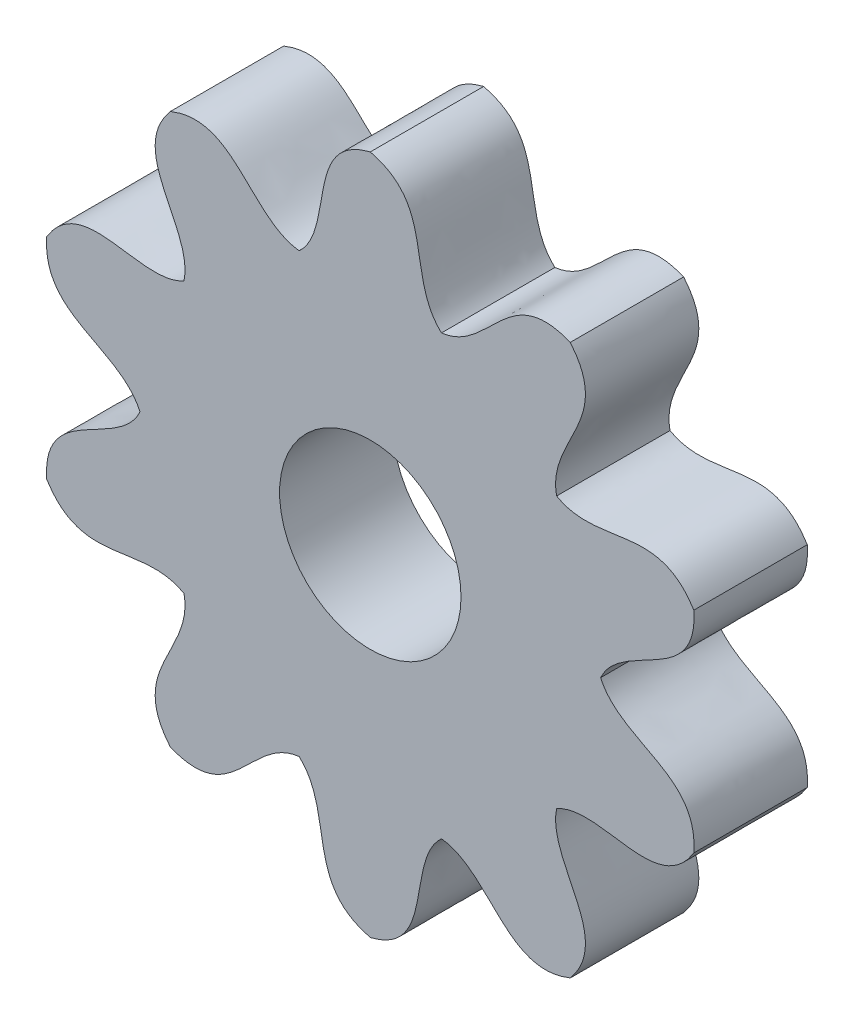
ISO-10303-21;
HEADER;
FILE_DESCRIPTION(('STEP AP214'),'2;1');
FILE_NAME('part.step','',(''),(''),'','','');
FILE_SCHEMA(('AUTOMOTIVE_DESIGN { 1 0 10303 214 1 1 1 1 }'));
ENDSEC;
DATA;
#1=APPLICATION_CONTEXT('core data for automotive mechanical design processes');
#2=APPLICATION_PROTOCOL_DEFINITION('international standard','automotive_design',2000,#1);
#3=PRODUCT_CONTEXT('',#1,'mechanical');
#4=PRODUCT('Part','Part','',(#3));
#5=PRODUCT_RELATED_PRODUCT_CATEGORY('part','',(#4));
#6=PRODUCT_DEFINITION_FORMATION('','',#4);
#7=PRODUCT_DEFINITION_CONTEXT('part definition',#1,'design');
#8=PRODUCT_DEFINITION('design','',#6,#7);
#9=PRODUCT_DEFINITION_SHAPE('','',#8);
#10=(LENGTH_UNIT() NAMED_UNIT(*) SI_UNIT(.MILLI.,.METRE.));
#11=(NAMED_UNIT(*) PLANE_ANGLE_UNIT() SI_UNIT($,.RADIAN.));
#12=(NAMED_UNIT(*) SI_UNIT($,.STERADIAN.) SOLID_ANGLE_UNIT());
#13=UNCERTAINTY_MEASURE_WITH_UNIT(LENGTH_MEASURE(1.E-05),#10,'distance_accuracy_value','');
#14=(GEOMETRIC_REPRESENTATION_CONTEXT(3) GLOBAL_UNCERTAINTY_ASSIGNED_CONTEXT((#13)) GLOBAL_UNIT_ASSIGNED_CONTEXT((#10,
#11,#12)) REPRESENTATION_CONTEXT('',''));
#15=CARTESIAN_POINT('',(0.,0.,0.));
#16=DIRECTION('',(0.,0.,1.));
#17=DIRECTION('',(1.,0.,0.));
#18=AXIS2_PLACEMENT_3D('',#15,#16,#17);
#19=CARTESIAN_POINT('',(-8.81677878438694,12.1352549156243,5.));
#20=CARTESIAN_POINT('',(-5.78764525168965,13.3651357182011,5.));
#21=CARTESIAN_POINT('',(-5.20847059966694,9.34250488062444,5.));
#22=CARTESIAN_POINT('',(-2.58868303739153,9.65912626130963,5.));
#23=B_SPLINE_CURVE_WITH_KNOTS('',3,(#19,#20,#21,#22),.UNSPECIFIED.,.F.,.F.,(4,4),(0.,1.),.UNSPECIFIED.);
#24=DIRECTION('',(0.,0.,-1.));
#25=VECTOR('',#24,1.);
#26=SURFACE_OF_LINEAR_EXTRUSION('',#23,#25);
#27=CARTESIAN_POINT('',(-8.81677878438694,12.1352549156243,0.));
#28=CARTESIAN_POINT('',(-5.78764525168965,13.3651357182011,0.));
#29=CARTESIAN_POINT('',(-5.20847059966694,9.34250488062444,0.));
#30=CARTESIAN_POINT('',(-2.58868303739153,9.65912626130963,0.));
#31=B_SPLINE_CURVE_WITH_KNOTS('',3,(#27,#28,#29,#30),.UNSPECIFIED.,.F.,.F.,(4,4),(0.,1.),.UNSPECIFIED.);
#32=CARTESIAN_POINT('',(-8.81677878438694,12.1352549156243,0.));
#33=VERTEX_POINT('',#32);
#34=CARTESIAN_POINT('',(-3.13745877046232,9.65610520636011,0.));
#35=VERTEX_POINT('',#34);
#36=EDGE_CURVE('E433',#33,#35,#31,.T.);
#37=ORIENTED_EDGE('',*,*,#36,.F.);
#38=DIRECTION('',(0.,0.,-1.));
#39=VECTOR('',#38,1.);
#40=CARTESIAN_POINT('',(-8.81677878438694,12.1352549156243,5.));
#41=LINE('',#40,#39);
#42=CARTESIAN_POINT('',(-8.81677878438694,12.1352549156243,5.));
#43=VERTEX_POINT('',#42);
#44=EDGE_CURVE('E11',#43,#33,#41,.T.);
#45=ORIENTED_EDGE('',*,*,#44,.F.);
#46=CARTESIAN_POINT('',(-3.13745877046232,9.65610520636011,5.));
#47=VERTEX_POINT('',#46);
#48=EDGE_CURVE('E603',#43,#47,#23,.T.);
#49=ORIENTED_EDGE('',*,*,#48,.T.);
#50=DIRECTION('',(0.,0.,-1.));
#51=VECTOR('',#50,1.);
#52=CARTESIAN_POINT('',(-3.13745877046232,9.65610520636011,5.));
#53=LINE('',#52,#51);
#54=EDGE_CURVE('E129',#47,#35,#53,.T.);
#55=ORIENTED_EDGE('',*,*,#54,.T.);
#56=EDGE_LOOP('',(#37,#45,#49,#55));
#57=FACE_BOUND('',#56,.T.);
#58=ADVANCED_FACE('F41',(#57),#26,.T.);
#59=CARTESIAN_POINT('',(-8.81677878438694,12.1352549156243,5.));
#60=CARTESIAN_POINT('',(-10.9225186757785,9.63443179967619,5.));
#61=CARTESIAN_POINT('',(-7.27574421523759,7.840542681889,5.));
#62=CARTESIAN_POINT('',(-8.38642792093188,5.44681803689219,5.));
#63=B_SPLINE_CURVE_WITH_KNOTS('',3,(#59,#60,#61,#62),.UNSPECIFIED.,.F.,.F.,(4,4),(0.,1.),.UNSPECIFIED.);
#64=DIRECTION('',(0.,0.,-1.));
#65=VECTOR('',#64,1.);
#66=SURFACE_OF_LINEAR_EXTRUSION('',#63,#65);
#67=CARTESIAN_POINT('',(-8.81677878438694,12.1352549156243,0.));
#68=CARTESIAN_POINT('',(-10.9225186757785,9.63443179967619,0.));
#69=CARTESIAN_POINT('',(-7.27574421523759,7.840542681889,0.));
#70=CARTESIAN_POINT('',(-8.38642792093188,5.44681803689219,0.));
#71=B_SPLINE_CURVE_WITH_KNOTS('',3,(#67,#68,#69,#70),.UNSPECIFIED.,.F.,.F.,(4,4),(0.,1.),.UNSPECIFIED.);
#72=CARTESIAN_POINT('',(-8.21397369931663,5.96780121649338,0.));
#73=VERTEX_POINT('',#72);
#74=EDGE_CURVE('E427',#33,#73,#71,.T.);
#75=ORIENTED_EDGE('',*,*,#74,.T.);
#76=DIRECTION('',(0.,0.,-1.));
#77=VECTOR('',#76,1.);
#78=CARTESIAN_POINT('',(-8.21397369931663,5.96780121649338,5.));
#79=LINE('',#78,#77);
#80=CARTESIAN_POINT('',(-8.21397369931663,5.96780121649338,5.));
#81=VERTEX_POINT('',#80);
#82=EDGE_CURVE('E51',#81,#73,#79,.T.);
#83=ORIENTED_EDGE('',*,*,#82,.F.);
#84=EDGE_CURVE('E408',#43,#81,#63,.T.);
#85=ORIENTED_EDGE('',*,*,#84,.F.);
#86=ORIENTED_EDGE('',*,*,#44,.T.);
#87=EDGE_LOOP('',(#75,#83,#85,#86));
#88=FACE_BOUND('',#87,.T.);
#89=ADVANCED_FACE('F417',(#88),#66,.F.);
#90=CARTESIAN_POINT('',(-14.2658477444273,4.63525491562437,5.));
#91=CARTESIAN_POINT('',(-12.5381330360764,7.41072940370857,5.));
#92=CARTESIAN_POINT('',(-9.70512781813433,4.49678301297288,5.));
#93=CARTESIAN_POINT('',(-7.77178053672865,6.2928075839744,5.));
#94=B_SPLINE_CURVE_WITH_KNOTS('',3,(#90,#91,#92,#93),.UNSPECIFIED.,.F.,.F.,(4,4),(0.,1.),.UNSPECIFIED.);
#95=DIRECTION('',(0.,0.,-1.));
#96=VECTOR('',#95,1.);
#97=SURFACE_OF_LINEAR_EXTRUSION('',#94,#96);
#98=CARTESIAN_POINT('',(-14.2658477444273,4.63525491562437,0.));
#99=CARTESIAN_POINT('',(-12.5381330360764,7.41072940370857,0.));
#100=CARTESIAN_POINT('',(-9.70512781813433,4.49678301297288,0.));
#101=CARTESIAN_POINT('',(-7.77178053672865,6.2928075839744,0.));
#102=B_SPLINE_CURVE_WITH_KNOTS('',3,(#98,#99,#100,#101),.UNSPECIFIED.,.F.,.F.,(4,4),(0.,1.),.UNSPECIFIED.);
#103=CARTESIAN_POINT('',(-14.2658477444273,4.63525491562437,0.));
#104=VERTEX_POINT('',#103);
#105=EDGE_CURVE('E432',#104,#73,#102,.T.);
#106=ORIENTED_EDGE('',*,*,#105,.F.);
#107=DIRECTION('',(0.,0.,-1.));
#108=VECTOR('',#107,1.);
#109=CARTESIAN_POINT('',(-14.2658477444273,4.63525491562437,5.));
#110=LINE('',#109,#108);
#111=CARTESIAN_POINT('',(-14.2658477444273,4.63525491562437,5.));
#112=VERTEX_POINT('',#111);
#113=EDGE_CURVE('E649',#112,#104,#110,.T.);
#114=ORIENTED_EDGE('',*,*,#113,.F.);
#115=EDGE_CURVE('E398',#112,#81,#94,.T.);
#116=ORIENTED_EDGE('',*,*,#115,.T.);
#117=ORIENTED_EDGE('',*,*,#82,.T.);
#118=EDGE_LOOP('',(#106,#114,#116,#117));
#119=FACE_BOUND('',#118,.T.);
#120=ADVANCED_FACE('F415',(#119),#97,.T.);
#121=CARTESIAN_POINT('',(-14.2658477444273,4.63525491562437,5.));
#122=CARTESIAN_POINT('',(-14.4994801561498,1.37432366157274,5.));
#123=CARTESIAN_POINT('',(-10.4947560752365,2.06655712560138,5.));
#124=CARTESIAN_POINT('',(-9.98632202414032,-0.522850294223837,5.));
#125=B_SPLINE_CURVE_WITH_KNOTS('',3,(#121,#122,#123,#124),.UNSPECIFIED.,.F.,.F.,(4,4),(0.,1.),.UNSPECIFIED.);
#126=DIRECTION('',(0.,0.,-1.));
#127=VECTOR('',#126,1.);
#128=SURFACE_OF_LINEAR_EXTRUSION('',#125,#127);
#129=CARTESIAN_POINT('',(-14.2658477444273,4.63525491562437,0.));
#130=CARTESIAN_POINT('',(-14.4994801561498,1.37432366157274,0.));
#131=CARTESIAN_POINT('',(-10.4947560752365,2.06655712560138,0.));
#132=CARTESIAN_POINT('',(-9.98632202414032,-0.522850294223837,0.));
#133=B_SPLINE_CURVE_WITH_KNOTS('',3,(#129,#130,#131,#132),.UNSPECIFIED.,.F.,.F.,(4,4),(0.,1.),.UNSPECIFIED.);
#134=CARTESIAN_POINT('',(-10.1530298577639,1.80528064285673E-11,0.));
#135=VERTEX_POINT('',#134);
#136=EDGE_CURVE('E441',#104,#135,#133,.T.);
#137=ORIENTED_EDGE('',*,*,#136,.T.);
#138=DIRECTION('',(0.,0.,-1.));
#139=VECTOR('',#138,1.);
#140=CARTESIAN_POINT('',(-10.1530298577639,1.80528064285673E-11,5.));
#141=LINE('',#140,#139);
#142=CARTESIAN_POINT('',(-10.1530298577639,1.80528064285673E-11,5.));
#143=VERTEX_POINT('',#142);
#144=EDGE_CURVE('E646',#143,#135,#141,.T.);
#145=ORIENTED_EDGE('',*,*,#144,.F.);
#146=EDGE_CURVE('E389',#112,#143,#125,.T.);
#147=ORIENTED_EDGE('',*,*,#146,.F.);
#148=ORIENTED_EDGE('',*,*,#113,.T.);
#149=EDGE_LOOP('',(#137,#145,#147,#148));
#150=FACE_BOUND('',#149,.T.);
#151=ADVANCED_FACE('F379',(#150),#128,.F.);
#152=CARTESIAN_POINT('',(-14.2658477444273,-4.63525491562407,5.));
#153=CARTESIAN_POINT('',(-14.4994801561499,-1.37432366157243,5.));
#154=CARTESIAN_POINT('',(-10.4947560752365,-2.06655712560116,5.));
#155=CARTESIAN_POINT('',(-9.98632202414031,0.522850294224045,5.));
#156=B_SPLINE_CURVE_WITH_KNOTS('',3,(#152,#153,#154,#155),.UNSPECIFIED.,.F.,.F.,(4,4),(0.,1.),.UNSPECIFIED.);
#157=DIRECTION('',(0.,0.,-1.));
#158=VECTOR('',#157,1.);
#159=SURFACE_OF_LINEAR_EXTRUSION('',#156,#158);
#160=CARTESIAN_POINT('',(-14.2658477444273,-4.63525491562407,0.));
#161=CARTESIAN_POINT('',(-14.4994801561499,-1.37432366157243,0.));
#162=CARTESIAN_POINT('',(-10.4947560752365,-2.06655712560116,0.));
#163=CARTESIAN_POINT('',(-9.98632202414031,0.522850294224045,0.));
#164=B_SPLINE_CURVE_WITH_KNOTS('',3,(#160,#161,#162,#163),.UNSPECIFIED.,.F.,.F.,(4,4),(0.,1.),.UNSPECIFIED.);
#165=CARTESIAN_POINT('',(-14.2658477444273,-4.63525491562407,0.));
#166=VERTEX_POINT('',#165);
#167=EDGE_CURVE('E445',#166,#135,#164,.T.);
#168=ORIENTED_EDGE('',*,*,#167,.F.);
#169=DIRECTION('',(0.,0.,-1.));
#170=VECTOR('',#169,1.);
#171=CARTESIAN_POINT('',(-14.2658477444273,-4.63525491562407,5.));
#172=LINE('',#171,#170);
#173=CARTESIAN_POINT('',(-14.2658477444273,-4.63525491562407,5.));
#174=VERTEX_POINT('',#173);
#175=EDGE_CURVE('E643',#174,#166,#172,.T.);
#176=ORIENTED_EDGE('',*,*,#175,.F.);
#177=EDGE_CURVE('E383',#174,#143,#156,.T.);
#178=ORIENTED_EDGE('',*,*,#177,.T.);
#179=ORIENTED_EDGE('',*,*,#144,.T.);
#180=EDGE_LOOP('',(#168,#176,#178,#179));
#181=FACE_BOUND('',#180,.T.);
#182=ADVANCED_FACE('F375',(#181),#159,.T.);
#183=CARTESIAN_POINT('',(-14.2658477444273,-4.63525491562407,5.));
#184=CARTESIAN_POINT('',(-12.5381330360766,-7.4107294037083,5.));
#185=CARTESIAN_POINT('',(-9.70512781813442,-4.49678301297268,5.));
#186=CARTESIAN_POINT('',(-7.77178053672878,-6.29280758397424,5.));
#187=B_SPLINE_CURVE_WITH_KNOTS('',3,(#183,#184,#185,#186),.UNSPECIFIED.,.F.,.F.,(4,4),(0.,1.),.UNSPECIFIED.);
#188=DIRECTION('',(0.,0.,-1.));
#189=VECTOR('',#188,1.);
#190=SURFACE_OF_LINEAR_EXTRUSION('',#187,#189);
#191=CARTESIAN_POINT('',(-14.2658477444273,-4.63525491562407,0.));
#192=CARTESIAN_POINT('',(-12.5381330360766,-7.4107294037083,0.));
#193=CARTESIAN_POINT('',(-9.70512781813442,-4.49678301297268,0.));
#194=CARTESIAN_POINT('',(-7.77178053672878,-6.29280758397424,0.));
#195=B_SPLINE_CURVE_WITH_KNOTS('',3,(#191,#192,#193,#194),.UNSPECIFIED.,.F.,.F.,(4,4),(0.,1.),.UNSPECIFIED.);
#196=CARTESIAN_POINT('',(-8.21397369933785,-5.96780121646417,0.));
#197=VERTEX_POINT('',#196);
#198=EDGE_CURVE('E465',#166,#197,#195,.T.);
#199=ORIENTED_EDGE('',*,*,#198,.T.);
#200=DIRECTION('',(0.,0.,-1.));
#201=VECTOR('',#200,1.);
#202=CARTESIAN_POINT('',(-8.21397369933785,-5.96780121646417,5.));
#203=LINE('',#202,#201);
#204=CARTESIAN_POINT('',(-8.21397369933785,-5.96780121646417,5.));
#205=VERTEX_POINT('',#204);
#206=EDGE_CURVE('E640',#205,#197,#203,.T.);
#207=ORIENTED_EDGE('',*,*,#206,.F.);
#208=EDGE_CURVE('E360',#174,#205,#187,.T.);
#209=ORIENTED_EDGE('',*,*,#208,.F.);
#210=ORIENTED_EDGE('',*,*,#175,.T.);
#211=EDGE_LOOP('',(#199,#207,#209,#210));
#212=FACE_BOUND('',#211,.T.);
#213=ADVANCED_FACE('F371',(#212),#190,.F.);
#214=CARTESIAN_POINT('',(-8.8167787843872,-12.1352549156241,5.));
#215=CARTESIAN_POINT('',(-10.9225186757787,-9.63443179967596,5.));
#216=CARTESIAN_POINT('',(-7.27574421523775,-7.84054268188883,5.));
#217=CARTESIAN_POINT('',(-8.386427920932,-5.446818036892,5.));
#218=B_SPLINE_CURVE_WITH_KNOTS('',3,(#214,#215,#216,#217),.UNSPECIFIED.,.F.,.F.,(4,4),(0.,1.),.UNSPECIFIED.);
#219=DIRECTION('',(0.,0.,-1.));
#220=VECTOR('',#219,1.);
#221=SURFACE_OF_LINEAR_EXTRUSION('',#218,#220);
#222=CARTESIAN_POINT('',(-8.8167787843872,-12.1352549156241,0.));
#223=CARTESIAN_POINT('',(-10.9225186757787,-9.63443179967596,0.));
#224=CARTESIAN_POINT('',(-7.27574421523775,-7.84054268188883,0.));
#225=CARTESIAN_POINT('',(-8.386427920932,-5.446818036892,0.));
#226=B_SPLINE_CURVE_WITH_KNOTS('',3,(#222,#223,#224,#225),.UNSPECIFIED.,.F.,.F.,(4,4),(0.,1.),.UNSPECIFIED.);
#227=CARTESIAN_POINT('',(-8.8167787843872,-12.1352549156241,0.));
#228=VERTEX_POINT('',#227);
#229=EDGE_CURVE('E474',#228,#197,#226,.T.);
#230=ORIENTED_EDGE('',*,*,#229,.F.);
#231=DIRECTION('',(0.,0.,-1.));
#232=VECTOR('',#231,1.);
#233=CARTESIAN_POINT('',(-8.8167787843872,-12.1352549156241,5.));
#234=LINE('',#233,#232);
#235=CARTESIAN_POINT('',(-8.8167787843872,-12.1352549156241,5.));
#236=VERTEX_POINT('',#235);
#237=EDGE_CURVE('E637',#236,#228,#234,.T.);
#238=ORIENTED_EDGE('',*,*,#237,.F.);
#239=EDGE_CURVE('E350',#236,#205,#218,.T.);
#240=ORIENTED_EDGE('',*,*,#239,.T.);
#241=ORIENTED_EDGE('',*,*,#206,.T.);
#242=EDGE_LOOP('',(#230,#238,#240,#241));
#243=FACE_BOUND('',#242,.T.);
#244=ADVANCED_FACE('F368',(#243),#221,.T.);
#245=CARTESIAN_POINT('',(-8.8167787843872,-12.1352549156241,5.));
#246=CARTESIAN_POINT('',(-5.78764525168994,-13.365135718201,5.));
#247=CARTESIAN_POINT('',(-5.20847059966714,-9.34250488062431,5.));
#248=CARTESIAN_POINT('',(-2.58868303739174,-9.65912626130957,5.));
#249=B_SPLINE_CURVE_WITH_KNOTS('',3,(#245,#246,#247,#248),.UNSPECIFIED.,.F.,.F.,(4,4),(0.,1.),.UNSPECIFIED.);
#250=DIRECTION('',(0.,0.,-1.));
#251=VECTOR('',#250,1.);
#252=SURFACE_OF_LINEAR_EXTRUSION('',#249,#251);
#253=CARTESIAN_POINT('',(-8.8167787843872,-12.1352549156241,0.));
#254=CARTESIAN_POINT('',(-5.78764525168994,-13.365135718201,0.));
#255=CARTESIAN_POINT('',(-5.20847059966714,-9.34250488062431,0.));
#256=CARTESIAN_POINT('',(-2.58868303739174,-9.65912626130957,0.));
#257=B_SPLINE_CURVE_WITH_KNOTS('',3,(#253,#254,#255,#256),.UNSPECIFIED.,.F.,.F.,(4,4),(0.,1.),.UNSPECIFIED.);
#258=CARTESIAN_POINT('',(-3.13745877046245,-9.65610520636004,0.));
#259=VERTEX_POINT('',#258);
#260=EDGE_CURVE('E483',#228,#259,#257,.T.);
#261=ORIENTED_EDGE('',*,*,#260,.T.);
#262=DIRECTION('',(0.,0.,-1.));
#263=VECTOR('',#262,1.);
#264=CARTESIAN_POINT('',(-3.13745877046245,-9.65610520636004,5.));
#265=LINE('',#264,#263);
#266=CARTESIAN_POINT('',(-3.13745877046245,-9.65610520636004,5.));
#267=VERTEX_POINT('',#266);
#268=EDGE_CURVE('E634',#267,#259,#265,.T.);
#269=ORIENTED_EDGE('',*,*,#268,.F.);
#270=EDGE_CURVE('E341',#236,#267,#249,.T.);
#271=ORIENTED_EDGE('',*,*,#270,.F.);
#272=ORIENTED_EDGE('',*,*,#237,.T.);
#273=EDGE_LOOP('',(#261,#269,#271,#272));
#274=FACE_BOUND('',#273,.T.);
#275=ADVANCED_FACE('F331',(#274),#252,.F.);
#276=CARTESIAN_POINT('',(-1.04744440165294E-13,-15.,5.));
#277=CARTESIAN_POINT('',(-3.17352630401551,-14.2145144525961,5.));
#278=CARTESIAN_POINT('',(-1.2776453584686,-10.6197074239392,5.));
#279=CARTESIAN_POINT('',(-3.58320339612877,-9.33598700845129,5.));
#280=B_SPLINE_CURVE_WITH_KNOTS('',3,(#276,#277,#278,#279),.UNSPECIFIED.,.F.,.F.,(4,4),(0.,1.),.UNSPECIFIED.);
#281=DIRECTION('',(0.,0.,-1.));
#282=VECTOR('',#281,1.);
#283=SURFACE_OF_LINEAR_EXTRUSION('',#280,#282);
#284=CARTESIAN_POINT('',(-1.04744440165294E-13,-15.,0.));
#285=CARTESIAN_POINT('',(-3.17352630401551,-14.2145144525961,0.));
#286=CARTESIAN_POINT('',(-1.2776453584686,-10.6197074239392,0.));
#287=CARTESIAN_POINT('',(-3.58320339612877,-9.33598700845129,0.));
#288=B_SPLINE_CURVE_WITH_KNOTS('',3,(#284,#285,#286,#287),.UNSPECIFIED.,.F.,.F.,(4,4),(0.,1.),.UNSPECIFIED.);
#289=CARTESIAN_POINT('',(-1.04744440165294E-13,-15.,0.));
#290=VERTEX_POINT('',#289);
#291=EDGE_CURVE('E492',#290,#259,#288,.T.);
#292=ORIENTED_EDGE('',*,*,#291,.F.);
#293=DIRECTION('',(0.,0.,-1.));
#294=VECTOR('',#293,1.);
#295=CARTESIAN_POINT('',(-1.04744440165294E-13,-15.,5.));
#296=LINE('',#295,#294);
#297=CARTESIAN_POINT('',(-1.04744440165294E-13,-15.,5.));
#298=VERTEX_POINT('',#297);
#299=EDGE_CURVE('E631',#298,#290,#296,.T.);
#300=ORIENTED_EDGE('',*,*,#299,.F.);
#301=EDGE_CURVE('E335',#298,#267,#280,.T.);
#302=ORIENTED_EDGE('',*,*,#301,.T.);
#303=ORIENTED_EDGE('',*,*,#268,.T.);
#304=EDGE_LOOP('',(#292,#300,#302,#303));
#305=FACE_BOUND('',#304,.T.);
#306=ADVANCED_FACE('F327',(#305),#283,.T.);
#307=CARTESIAN_POINT('',(-1.04744440165294E-13,-15.,5.));
#308=CARTESIAN_POINT('',(3.17352630401531,-14.2145144525961,5.));
#309=CARTESIAN_POINT('',(1.27764535846846,-10.6197074239392,5.));
#310=CARTESIAN_POINT('',(3.58320339612864,-9.33598700845134,5.));
#311=B_SPLINE_CURVE_WITH_KNOTS('',3,(#307,#308,#309,#310),.UNSPECIFIED.,.F.,.F.,(4,4),(0.,1.),.UNSPECIFIED.);
#312=DIRECTION('',(0.,0.,-1.));
#313=VECTOR('',#312,1.);
#314=SURFACE_OF_LINEAR_EXTRUSION('',#311,#313);
#315=CARTESIAN_POINT('',(-1.04744440165294E-13,-15.,0.));
#316=CARTESIAN_POINT('',(3.17352630401531,-14.2145144525961,0.));
#317=CARTESIAN_POINT('',(1.27764535846846,-10.6197074239392,0.));
#318=CARTESIAN_POINT('',(3.58320339612864,-9.33598700845134,0.));
#319=B_SPLINE_CURVE_WITH_KNOTS('',3,(#315,#316,#317,#318),.UNSPECIFIED.,.F.,.F.,(4,4),(0.,1.),.UNSPECIFIED.);
#320=CARTESIAN_POINT('',(3.13745877042817,-9.65610520637118,0.));
#321=VERTEX_POINT('',#320);
#322=EDGE_CURVE('E501',#290,#321,#319,.T.);
#323=ORIENTED_EDGE('',*,*,#322,.T.);
#324=DIRECTION('',(0.,0.,-1.));
#325=VECTOR('',#324,1.);
#326=CARTESIAN_POINT('',(3.13745877042817,-9.65610520637118,5.));
#327=LINE('',#326,#325);
#328=CARTESIAN_POINT('',(3.13745877042817,-9.65610520637118,5.));
#329=VERTEX_POINT('',#328);
#330=EDGE_CURVE('E628',#329,#321,#327,.T.);
#331=ORIENTED_EDGE('',*,*,#330,.F.);
#332=EDGE_CURVE('E312',#298,#329,#311,.T.);
#333=ORIENTED_EDGE('',*,*,#332,.F.);
#334=ORIENTED_EDGE('',*,*,#299,.T.);
#335=EDGE_LOOP('',(#323,#331,#333,#334));
#336=FACE_BOUND('',#335,.T.);
#337=ADVANCED_FACE('F323',(#336),#314,.F.);
#338=CARTESIAN_POINT('',(8.81677878438703,-12.1352549156243,5.));
#339=CARTESIAN_POINT('',(5.78764525168975,-13.3651357182011,5.));
#340=CARTESIAN_POINT('',(5.20847059966701,-9.3425048806244,5.));
#341=CARTESIAN_POINT('',(2.5886830373916,-9.65912626130961,5.));
#342=B_SPLINE_CURVE_WITH_KNOTS('',3,(#338,#339,#340,#341),.UNSPECIFIED.,.F.,.F.,(4,4),(0.,1.),.UNSPECIFIED.);
#343=DIRECTION('',(0.,0.,-1.));
#344=VECTOR('',#343,1.);
#345=SURFACE_OF_LINEAR_EXTRUSION('',#342,#344);
#346=CARTESIAN_POINT('',(8.81677878438703,-12.1352549156243,0.));
#347=CARTESIAN_POINT('',(5.78764525168975,-13.3651357182011,0.));
#348=CARTESIAN_POINT('',(5.20847059966701,-9.3425048806244,0.));
#349=CARTESIAN_POINT('',(2.5886830373916,-9.65912626130961,0.));
#350=B_SPLINE_CURVE_WITH_KNOTS('',3,(#346,#347,#348,#349),.UNSPECIFIED.,.F.,.F.,(4,4),(0.,1.),.UNSPECIFIED.);
#351=CARTESIAN_POINT('',(8.81677878438703,-12.1352549156243,0.));
#352=VERTEX_POINT('',#351);
#353=EDGE_CURVE('E510',#352,#321,#350,.T.);
#354=ORIENTED_EDGE('',*,*,#353,.F.);
#355=DIRECTION('',(0.,0.,-1.));
#356=VECTOR('',#355,1.);
#357=CARTESIAN_POINT('',(8.81677878438703,-12.1352549156243,5.));
#358=LINE('',#357,#356);
#359=CARTESIAN_POINT('',(8.81677878438703,-12.1352549156243,5.));
#360=VERTEX_POINT('',#359);
#361=EDGE_CURVE('E625',#360,#352,#358,.T.);
#362=ORIENTED_EDGE('',*,*,#361,.F.);
#363=EDGE_CURVE('E302',#360,#329,#342,.T.);
#364=ORIENTED_EDGE('',*,*,#363,.T.);
#365=ORIENTED_EDGE('',*,*,#330,.T.);
#366=EDGE_LOOP('',(#354,#362,#364,#365));
#367=FACE_BOUND('',#366,.T.);
#368=ADVANCED_FACE('F320',(#367),#345,.T.);
#369=CARTESIAN_POINT('',(8.81677878438703,-12.1352549156243,5.));
#370=CARTESIAN_POINT('',(10.9225186757785,-9.63443179967612,5.));
#371=CARTESIAN_POINT('',(7.27574421523764,-7.84054268188894,5.));
#372=CARTESIAN_POINT('',(8.38642792093193,-5.44681803689213,5.));
#373=B_SPLINE_CURVE_WITH_KNOTS('',3,(#369,#370,#371,#372),.UNSPECIFIED.,.F.,.F.,(4,4),(0.,1.),.UNSPECIFIED.);
#374=DIRECTION('',(0.,0.,-1.));
#375=VECTOR('',#374,1.);
#376=SURFACE_OF_LINEAR_EXTRUSION('',#373,#375);
#377=CARTESIAN_POINT('',(8.81677878438703,-12.1352549156243,0.));
#378=CARTESIAN_POINT('',(10.9225186757785,-9.63443179967612,0.));
#379=CARTESIAN_POINT('',(7.27574421523764,-7.84054268188894,0.));
#380=CARTESIAN_POINT('',(8.38642792093193,-5.44681803689213,0.));
#381=B_SPLINE_CURVE_WITH_KNOTS('',3,(#377,#378,#379,#380),.UNSPECIFIED.,.F.,.F.,(4,4),(0.,1.),.UNSPECIFIED.);
#382=CARTESIAN_POINT('',(8.21397369931668,-5.96780121649332,0.));
#383=VERTEX_POINT('',#382);
#384=EDGE_CURVE('E519',#352,#383,#381,.T.);
#385=ORIENTED_EDGE('',*,*,#384,.T.);
#386=DIRECTION('',(0.,0.,-1.));
#387=VECTOR('',#386,1.);
#388=CARTESIAN_POINT('',(8.21397369931668,-5.96780121649332,5.));
#389=LINE('',#388,#387);
#390=CARTESIAN_POINT('',(8.21397369931668,-5.96780121649332,5.));
#391=VERTEX_POINT('',#390);
#392=EDGE_CURVE('E622',#391,#383,#389,.T.);
#393=ORIENTED_EDGE('',*,*,#392,.F.);
#394=EDGE_CURVE('E293',#360,#391,#373,.T.);
#395=ORIENTED_EDGE('',*,*,#394,.F.);
#396=ORIENTED_EDGE('',*,*,#361,.T.);
#397=EDGE_LOOP('',(#385,#393,#395,#396));
#398=FACE_BOUND('',#397,.T.);
#399=ADVANCED_FACE('F283',(#398),#376,.F.);
#400=CARTESIAN_POINT('',(14.2658477444273,-4.63525491562427,5.));
#401=CARTESIAN_POINT('',(12.5381330360765,-7.41072940370848,5.));
#402=CARTESIAN_POINT('',(9.70512781813436,-4.49678301297281,5.));
#403=CARTESIAN_POINT('',(7.7717805367287,-6.29280758397435,5.));
#404=B_SPLINE_CURVE_WITH_KNOTS('',3,(#400,#401,#402,#403),.UNSPECIFIED.,.F.,.F.,(4,4),(0.,1.),.UNSPECIFIED.);
#405=DIRECTION('',(0.,0.,-1.));
#406=VECTOR('',#405,1.);
#407=SURFACE_OF_LINEAR_EXTRUSION('',#404,#406);
#408=CARTESIAN_POINT('',(14.2658477444273,-4.63525491562427,0.));
#409=CARTESIAN_POINT('',(12.5381330360765,-7.41072940370848,0.));
#410=CARTESIAN_POINT('',(9.70512781813436,-4.49678301297281,0.));
#411=CARTESIAN_POINT('',(7.7717805367287,-6.29280758397435,0.));
#412=B_SPLINE_CURVE_WITH_KNOTS('',3,(#408,#409,#410,#411),.UNSPECIFIED.,.F.,.F.,(4,4),(0.,1.),.UNSPECIFIED.);
#413=CARTESIAN_POINT('',(14.2658477444273,-4.63525491562427,0.));
#414=VERTEX_POINT('',#413);
#415=EDGE_CURVE('E528',#414,#383,#412,.T.);
#416=ORIENTED_EDGE('',*,*,#415,.F.);
#417=DIRECTION('',(0.,0.,-1.));
#418=VECTOR('',#417,1.);
#419=CARTESIAN_POINT('',(14.2658477444273,-4.63525491562427,5.));
#420=LINE('',#419,#418);
#421=CARTESIAN_POINT('',(14.2658477444273,-4.63525491562427,5.));
#422=VERTEX_POINT('',#421);
#423=EDGE_CURVE('E619',#422,#414,#420,.T.);
#424=ORIENTED_EDGE('',*,*,#423,.F.);
#425=EDGE_CURVE('E287',#422,#391,#404,.T.);
#426=ORIENTED_EDGE('',*,*,#425,.T.);
#427=ORIENTED_EDGE('',*,*,#392,.T.);
#428=EDGE_LOOP('',(#416,#424,#426,#427));
#429=FACE_BOUND('',#428,.T.);
#430=ADVANCED_FACE('F279',(#429),#407,.T.);
#431=CARTESIAN_POINT('',(14.2658477444273,-4.63525491562427,5.));
#432=CARTESIAN_POINT('',(14.4994801561498,-1.37432366157263,5.));
#433=CARTESIAN_POINT('',(10.4947560752365,-2.06655712560131,5.));
#434=CARTESIAN_POINT('',(9.98632202414032,0.522850294223906,5.));
#435=B_SPLINE_CURVE_WITH_KNOTS('',3,(#431,#432,#433,#434),.UNSPECIFIED.,.F.,.F.,(4,4),(0.,1.),.UNSPECIFIED.);
#436=DIRECTION('',(0.,0.,-1.));
#437=VECTOR('',#436,1.);
#438=SURFACE_OF_LINEAR_EXTRUSION('',#435,#437);
#439=CARTESIAN_POINT('',(14.2658477444273,-4.63525491562427,0.));
#440=CARTESIAN_POINT('',(14.4994801561498,-1.37432366157263,0.));
#441=CARTESIAN_POINT('',(10.4947560752365,-2.06655712560131,0.));
#442=CARTESIAN_POINT('',(9.98632202414032,0.522850294223906,0.));
#443=B_SPLINE_CURVE_WITH_KNOTS('',3,(#439,#440,#441,#442),.UNSPECIFIED.,.F.,.F.,(4,4),(0.,1.),.UNSPECIFIED.);
#444=CARTESIAN_POINT('',(10.1530298577639,-1.79762888602442E-11,0.));
#445=VERTEX_POINT('',#444);
#446=EDGE_CURVE('E537',#414,#445,#443,.T.);
#447=ORIENTED_EDGE('',*,*,#446,.T.);
#448=DIRECTION('',(0.,0.,-1.));
#449=VECTOR('',#448,1.);
#450=CARTESIAN_POINT('',(10.1530298577639,-1.79762888602442E-11,5.));
#451=LINE('',#450,#449);
#452=CARTESIAN_POINT('',(10.1530298577639,-1.79762888602442E-11,5.));
#453=VERTEX_POINT('',#452);
#454=EDGE_CURVE('E616',#453,#445,#451,.T.);
#455=ORIENTED_EDGE('',*,*,#454,.F.);
#456=EDGE_CURVE('E264',#422,#453,#435,.T.);
#457=ORIENTED_EDGE('',*,*,#456,.F.);
#458=ORIENTED_EDGE('',*,*,#423,.T.);
#459=EDGE_LOOP('',(#447,#455,#457,#458));
#460=FACE_BOUND('',#459,.T.);
#461=ADVANCED_FACE('F275',(#460),#438,.F.);
#462=CARTESIAN_POINT('',(14.2658477444273,4.63525491562417,5.));
#463=CARTESIAN_POINT('',(14.4994801561498,1.37432366157253,5.));
#464=CARTESIAN_POINT('',(10.4947560752365,2.06655712560123,5.));
#465=CARTESIAN_POINT('',(9.98632202414031,-0.522850294223977,5.));
#466=B_SPLINE_CURVE_WITH_KNOTS('',3,(#462,#463,#464,#465),.UNSPECIFIED.,.F.,.F.,(4,4),(0.,1.),.UNSPECIFIED.);
#467=DIRECTION('',(0.,0.,-1.));
#468=VECTOR('',#467,1.);
#469=SURFACE_OF_LINEAR_EXTRUSION('',#466,#468);
#470=CARTESIAN_POINT('',(14.2658477444273,4.63525491562417,0.));
#471=CARTESIAN_POINT('',(14.4994801561498,1.37432366157253,0.));
#472=CARTESIAN_POINT('',(10.4947560752365,2.06655712560123,0.));
#473=CARTESIAN_POINT('',(9.98632202414031,-0.522850294223977,0.));
#474=B_SPLINE_CURVE_WITH_KNOTS('',3,(#470,#471,#472,#473),.UNSPECIFIED.,.F.,.F.,(4,4),(0.,1.),.UNSPECIFIED.);
#475=CARTESIAN_POINT('',(14.2658477444273,4.63525491562417,0.));
#476=VERTEX_POINT('',#475);
#477=EDGE_CURVE('E546',#476,#445,#474,.T.);
#478=ORIENTED_EDGE('',*,*,#477,.F.);
#479=DIRECTION('',(0.,0.,-1.));
#480=VECTOR('',#479,1.);
#481=CARTESIAN_POINT('',(14.2658477444273,4.63525491562417,5.));
#482=LINE('',#481,#480);
#483=CARTESIAN_POINT('',(14.2658477444273,4.63525491562417,5.));
#484=VERTEX_POINT('',#483);
#485=EDGE_CURVE('E613',#484,#476,#482,.T.);
#486=ORIENTED_EDGE('',*,*,#485,.F.);
#487=EDGE_CURVE('E254',#484,#453,#466,.T.);
#488=ORIENTED_EDGE('',*,*,#487,.T.);
#489=ORIENTED_EDGE('',*,*,#454,.T.);
#490=EDGE_LOOP('',(#478,#486,#488,#489));
#491=FACE_BOUND('',#490,.T.);
#492=ADVANCED_FACE('F272',(#491),#469,.T.);
#493=CARTESIAN_POINT('',(14.2658477444273,4.63525491562417,5.));
#494=CARTESIAN_POINT('',(12.5381330360765,7.41072940370839,5.));
#495=CARTESIAN_POINT('',(9.7051278181344,4.49678301297275,5.));
#496=CARTESIAN_POINT('',(7.77178053672874,6.29280758397429,5.));
#497=B_SPLINE_CURVE_WITH_KNOTS('',3,(#493,#494,#495,#496),.UNSPECIFIED.,.F.,.F.,(4,4),(0.,1.),.UNSPECIFIED.);
#498=DIRECTION('',(0.,0.,-1.));
#499=VECTOR('',#498,1.);
#500=SURFACE_OF_LINEAR_EXTRUSION('',#497,#499);
#501=CARTESIAN_POINT('',(14.2658477444273,4.63525491562417,0.));
#502=CARTESIAN_POINT('',(12.5381330360765,7.41072940370839,0.));
#503=CARTESIAN_POINT('',(9.7051278181344,4.49678301297275,0.));
#504=CARTESIAN_POINT('',(7.77178053672874,6.29280758397429,0.));
#505=B_SPLINE_CURVE_WITH_KNOTS('',3,(#501,#502,#503,#504),.UNSPECIFIED.,.F.,.F.,(4,4),(0.,1.),.UNSPECIFIED.);
#506=CARTESIAN_POINT('',(8.21397369933781,5.96780121646424,0.));
#507=VERTEX_POINT('',#506);
#508=EDGE_CURVE('E555',#476,#507,#505,.T.);
#509=ORIENTED_EDGE('',*,*,#508,.T.);
#510=DIRECTION('',(0.,0.,-1.));
#511=VECTOR('',#510,1.);
#512=CARTESIAN_POINT('',(8.21397369933781,5.96780121646424,5.));
#513=LINE('',#512,#511);
#514=CARTESIAN_POINT('',(8.21397369933781,5.96780121646424,5.));
#515=VERTEX_POINT('',#514);
#516=EDGE_CURVE('E610',#515,#507,#513,.T.);
#517=ORIENTED_EDGE('',*,*,#516,.F.);
#518=EDGE_CURVE('E245',#484,#515,#497,.T.);
#519=ORIENTED_EDGE('',*,*,#518,.F.);
#520=ORIENTED_EDGE('',*,*,#485,.T.);
#521=EDGE_LOOP('',(#509,#517,#519,#520));
#522=FACE_BOUND('',#521,.T.);
#523=ADVANCED_FACE('F237',(#522),#500,.F.);
#524=CARTESIAN_POINT('',(8.81677878438711,12.1352549156242,5.));
#525=CARTESIAN_POINT('',(10.9225186757786,9.63443179967604,5.));
#526=CARTESIAN_POINT('',(7.27574421523769,7.8405426818889,5.));
#527=CARTESIAN_POINT('',(8.38642792093196,5.44681803689207,5.));
#528=B_SPLINE_CURVE_WITH_KNOTS('',3,(#524,#525,#526,#527),.UNSPECIFIED.,.F.,.F.,(4,4),(0.,1.),.UNSPECIFIED.);
#529=DIRECTION('',(0.,0.,-1.));
#530=VECTOR('',#529,1.);
#531=SURFACE_OF_LINEAR_EXTRUSION('',#528,#530);
#532=CARTESIAN_POINT('',(8.81677878438711,12.1352549156242,0.));
#533=CARTESIAN_POINT('',(10.9225186757786,9.63443179967604,0.));
#534=CARTESIAN_POINT('',(7.27574421523769,7.8405426818889,0.));
#535=CARTESIAN_POINT('',(8.38642792093196,5.44681803689207,0.));
#536=B_SPLINE_CURVE_WITH_KNOTS('',3,(#532,#533,#534,#535),.UNSPECIFIED.,.F.,.F.,(4,4),(0.,1.),.UNSPECIFIED.);
#537=CARTESIAN_POINT('',(8.81677878438711,12.1352549156242,0.));
#538=VERTEX_POINT('',#537);
#539=EDGE_CURVE('E564',#538,#507,#536,.T.);
#540=ORIENTED_EDGE('',*,*,#539,.F.);
#541=DIRECTION('',(0.,0.,-1.));
#542=VECTOR('',#541,1.);
#543=CARTESIAN_POINT('',(8.81677878438711,12.1352549156242,5.));
#544=LINE('',#543,#542);
#545=CARTESIAN_POINT('',(8.81677878438711,12.1352549156242,5.));
#546=VERTEX_POINT('',#545);
#547=EDGE_CURVE('E204',#546,#538,#544,.T.);
#548=ORIENTED_EDGE('',*,*,#547,.F.);
#549=EDGE_CURVE('E191',#546,#515,#528,.T.);
#550=ORIENTED_EDGE('',*,*,#549,.T.);
#551=ORIENTED_EDGE('',*,*,#516,.T.);
#552=EDGE_LOOP('',(#540,#548,#550,#551));
#553=FACE_BOUND('',#552,.T.);
#554=ADVANCED_FACE('F234',(#553),#531,.T.);
#555=CARTESIAN_POINT('',(8.81677878438711,12.1352549156242,5.));
#556=CARTESIAN_POINT('',(5.78764525168985,13.365135718201,5.));
#557=CARTESIAN_POINT('',(5.20847059966707,9.34250488062436,5.));
#558=CARTESIAN_POINT('',(2.58868303739167,9.65912626130959,5.));
#559=B_SPLINE_CURVE_WITH_KNOTS('',3,(#555,#556,#557,#558),.UNSPECIFIED.,.F.,.F.,(4,4),(0.,1.),.UNSPECIFIED.);
#560=DIRECTION('',(0.,0.,-1.));
#561=VECTOR('',#560,1.);
#562=SURFACE_OF_LINEAR_EXTRUSION('',#559,#561);
#563=CARTESIAN_POINT('',(8.81677878438711,12.1352549156242,0.));
#564=CARTESIAN_POINT('',(5.78764525168985,13.365135718201,0.));
#565=CARTESIAN_POINT('',(5.20847059966707,9.34250488062436,0.));
#566=CARTESIAN_POINT('',(2.58868303739167,9.65912626130959,0.));
#567=B_SPLINE_CURVE_WITH_KNOTS('',3,(#563,#564,#565,#566),.UNSPECIFIED.,.F.,.F.,(4,4),(0.,1.),.UNSPECIFIED.);
#568=CARTESIAN_POINT('',(3.13745877046237,9.65610520636007,0.));
#569=VERTEX_POINT('',#568);
#570=EDGE_CURVE('E199',#538,#569,#567,.T.);
#571=ORIENTED_EDGE('',*,*,#570,.T.);
#572=DIRECTION('',(0.,0.,-1.));
#573=VECTOR('',#572,1.);
#574=CARTESIAN_POINT('',(3.13745877046237,9.65610520636007,5.));
#575=LINE('',#574,#573);
#576=CARTESIAN_POINT('',(3.13745877046237,9.65610520636007,5.));
#577=VERTEX_POINT('',#576);
#578=EDGE_CURVE('E196',#577,#569,#575,.T.);
#579=ORIENTED_EDGE('',*,*,#578,.F.);
#580=EDGE_CURVE('E184',#546,#577,#559,.T.);
#581=ORIENTED_EDGE('',*,*,#580,.F.);
#582=ORIENTED_EDGE('',*,*,#547,.T.);
#583=EDGE_LOOP('',(#571,#579,#581,#582));
#584=FACE_BOUND('',#583,.T.);
#585=ADVANCED_FACE('F197',(#584),#562,.F.);
#586=CARTESIAN_POINT('',(0.,15.,5.));
#587=CARTESIAN_POINT('',(3.17352630401541,14.2145144525961,5.));
#588=CARTESIAN_POINT('',(1.27764535846853,10.6197074239392,5.));
#589=CARTESIAN_POINT('',(3.58320339612871,9.33598700845132,5.));
#590=B_SPLINE_CURVE_WITH_KNOTS('',3,(#586,#587,#588,#589),.UNSPECIFIED.,.F.,.F.,(4,4),(0.,1.),.UNSPECIFIED.);
#591=DIRECTION('',(0.,0.,-1.));
#592=VECTOR('',#591,1.);
#593=SURFACE_OF_LINEAR_EXTRUSION('',#590,#592);
#594=CARTESIAN_POINT('',(0.,15.,0.));
#595=CARTESIAN_POINT('',(3.17352630401541,14.2145144525961,0.));
#596=CARTESIAN_POINT('',(1.27764535846853,10.6197074239392,0.));
#597=CARTESIAN_POINT('',(3.58320339612871,9.33598700845132,0.));
#598=B_SPLINE_CURVE_WITH_KNOTS('',3,(#594,#595,#596,#597),.UNSPECIFIED.,.F.,.F.,(4,4),(0.,1.),.UNSPECIFIED.);
#599=CARTESIAN_POINT('',(0.,15.,0.));
#600=VERTEX_POINT('',#599);
#601=EDGE_CURVE('E580',#600,#569,#598,.T.);
#602=ORIENTED_EDGE('',*,*,#601,.F.);
#603=DIRECTION('',(0.,0.,-1.));
#604=VECTOR('',#603,1.);
#605=CARTESIAN_POINT('',(0.,15.,5.));
#606=LINE('',#605,#604);
#607=CARTESIAN_POINT('',(0.,15.,5.));
#608=VERTEX_POINT('',#607);
#609=EDGE_CURVE('E122',#608,#600,#606,.T.);
#610=ORIENTED_EDGE('',*,*,#609,.F.);
#611=EDGE_CURVE('E189',#608,#577,#590,.T.);
#612=ORIENTED_EDGE('',*,*,#611,.T.);
#613=ORIENTED_EDGE('',*,*,#578,.T.);
#614=EDGE_LOOP('',(#602,#610,#612,#613));
#615=FACE_BOUND('',#614,.T.);
#616=ADVANCED_FACE('F206',(#615),#593,.T.);
#617=CARTESIAN_POINT('',(0.,15.,5.));
#618=CARTESIAN_POINT('',(-3.17352630401541,14.2145144525961,5.));
#619=CARTESIAN_POINT('',(-1.27764535846853,10.6197074239392,5.));
#620=CARTESIAN_POINT('',(-3.58320339612871,9.33598700845131,5.));
#621=B_SPLINE_CURVE_WITH_KNOTS('',3,(#617,#618,#619,#620),.UNSPECIFIED.,.F.,.F.,(4,4),(0.,1.),.UNSPECIFIED.);
#622=DIRECTION('',(0.,0.,-1.));
#623=VECTOR('',#622,1.);
#624=SURFACE_OF_LINEAR_EXTRUSION('',#621,#623);
#625=CARTESIAN_POINT('',(0.,15.,0.));
#626=CARTESIAN_POINT('',(-3.17352630401541,14.2145144525961,0.));
#627=CARTESIAN_POINT('',(-1.27764535846853,10.6197074239392,0.));
#628=CARTESIAN_POINT('',(-3.58320339612871,9.33598700845131,0.));
#629=B_SPLINE_CURVE_WITH_KNOTS('',3,(#625,#626,#627,#628),.UNSPECIFIED.,.F.,.F.,(4,4),(0.,1.),.UNSPECIFIED.);
#630=EDGE_CURVE('E588',#600,#35,#629,.T.);
#631=ORIENTED_EDGE('',*,*,#630,.T.);
#632=ORIENTED_EDGE('',*,*,#54,.F.);
#633=EDGE_CURVE('E59',#608,#47,#621,.T.);
#634=ORIENTED_EDGE('',*,*,#633,.F.);
#635=ORIENTED_EDGE('',*,*,#609,.T.);
#636=EDGE_LOOP('',(#631,#632,#634,#635));
#637=FACE_BOUND('',#636,.T.);
#638=ADVANCED_FACE('F230',(#637),#624,.F.);
#639=CARTESIAN_POINT('',(0.,0.,5.));
#640=DIRECTION('',(0.,0.,-1.));
#641=DIRECTION('',(-1.,0.,0.));
#642=AXIS2_PLACEMENT_3D('',#639,#640,#641);
#643=CYLINDRICAL_SURFACE('',#642,4.);
#644=CARTESIAN_POINT('',(0.,0.,5.));
#645=DIRECTION('',(0.,0.,1.));
#646=DIRECTION('',(1.,0.,0.));
#647=AXIS2_PLACEMENT_3D('',#644,#645,#646);
#648=CIRCLE('',#647,4.);
#649=CARTESIAN_POINT('',(4.,0.,5.));
#650=VERTEX_POINT('',#649);
#651=EDGE_CURVE('E210',#650,#650,#648,.T.);
#652=ORIENTED_EDGE('',*,*,#651,.T.);
#653=EDGE_LOOP('',(#652));
#654=FACE_BOUND('',#653,.T.);
#655=CARTESIAN_POINT('',(0.,0.,0.));
#656=DIRECTION('',(0.,0.,1.));
#657=DIRECTION('',(1.,0.,0.));
#658=AXIS2_PLACEMENT_3D('',#655,#656,#657);
#659=CIRCLE('',#658,4.);
#660=CARTESIAN_POINT('',(4.,0.,0.));
#661=VERTEX_POINT('',#660);
#662=EDGE_CURVE('E596',#661,#661,#659,.T.);
#663=ORIENTED_EDGE('',*,*,#662,.F.);
#664=EDGE_LOOP('',(#663));
#665=FACE_BOUND('',#664,.T.);
#666=ADVANCED_FACE('F674',(#654,#665),#643,.F.);
#667=CARTESIAN_POINT('',(0.,0.,5.));
#668=DIRECTION('',(0.,0.,1.));
#669=DIRECTION('',(1.,0.,0.));
#670=AXIS2_PLACEMENT_3D('',#667,#668,#669);
#671=PLANE('',#670);
#672=ORIENTED_EDGE('',*,*,#48,.F.);
#673=ORIENTED_EDGE('',*,*,#84,.T.);
#674=ORIENTED_EDGE('',*,*,#115,.F.);
#675=ORIENTED_EDGE('',*,*,#146,.T.);
#676=ORIENTED_EDGE('',*,*,#177,.F.);
#677=ORIENTED_EDGE('',*,*,#208,.T.);
#678=ORIENTED_EDGE('',*,*,#239,.F.);
#679=ORIENTED_EDGE('',*,*,#270,.T.);
#680=ORIENTED_EDGE('',*,*,#301,.F.);
#681=ORIENTED_EDGE('',*,*,#332,.T.);
#682=ORIENTED_EDGE('',*,*,#363,.F.);
#683=ORIENTED_EDGE('',*,*,#394,.T.);
#684=ORIENTED_EDGE('',*,*,#425,.F.);
#685=ORIENTED_EDGE('',*,*,#456,.T.);
#686=ORIENTED_EDGE('',*,*,#487,.F.);
#687=ORIENTED_EDGE('',*,*,#518,.T.);
#688=ORIENTED_EDGE('',*,*,#549,.F.);
#689=ORIENTED_EDGE('',*,*,#580,.T.);
#690=ORIENTED_EDGE('',*,*,#611,.F.);
#691=ORIENTED_EDGE('',*,*,#633,.T.);
#692=EDGE_LOOP('',(#672,#673,#674,#675,#676,#677,#678,#679,#680,#681,#682,#683,#684,#685,#686,
#687,#688,#689,#690,#691));
#693=FACE_BOUND('',#692,.T.);
#694=ORIENTED_EDGE('',*,*,#651,.F.);
#695=EDGE_LOOP('',(#694));
#696=FACE_BOUND('',#695,.T.);
#697=ADVANCED_FACE('F186',(#693,#696),#671,.T.);
#698=CARTESIAN_POINT('',(0.,0.,0.));
#699=DIRECTION('',(0.,0.,1.));
#700=DIRECTION('',(1.,0.,0.));
#701=AXIS2_PLACEMENT_3D('',#698,#699,#700);
#702=PLANE('',#701);
#703=ORIENTED_EDGE('',*,*,#36,.T.);
#704=ORIENTED_EDGE('',*,*,#630,.F.);
#705=ORIENTED_EDGE('',*,*,#601,.T.);
#706=ORIENTED_EDGE('',*,*,#570,.F.);
#707=ORIENTED_EDGE('',*,*,#539,.T.);
#708=ORIENTED_EDGE('',*,*,#508,.F.);
#709=ORIENTED_EDGE('',*,*,#477,.T.);
#710=ORIENTED_EDGE('',*,*,#446,.F.);
#711=ORIENTED_EDGE('',*,*,#415,.T.);
#712=ORIENTED_EDGE('',*,*,#384,.F.);
#713=ORIENTED_EDGE('',*,*,#353,.T.);
#714=ORIENTED_EDGE('',*,*,#322,.F.);
#715=ORIENTED_EDGE('',*,*,#291,.T.);
#716=ORIENTED_EDGE('',*,*,#260,.F.);
#717=ORIENTED_EDGE('',*,*,#229,.T.);
#718=ORIENTED_EDGE('',*,*,#198,.F.);
#719=ORIENTED_EDGE('',*,*,#167,.T.);
#720=ORIENTED_EDGE('',*,*,#136,.F.);
#721=ORIENTED_EDGE('',*,*,#105,.T.);
#722=ORIENTED_EDGE('',*,*,#74,.F.);
#723=EDGE_LOOP('',(#703,#704,#705,#706,#707,#708,#709,#710,#711,#712,#713,#714,#715,#716,#717,
#718,#719,#720,#721,#722));
#724=FACE_BOUND('',#723,.T.);
#725=ORIENTED_EDGE('',*,*,#662,.T.);
#726=EDGE_LOOP('',(#725));
#727=FACE_BOUND('',#726,.T.);
#728=ADVANCED_FACE('F437',(#724,#727),#702,.F.);
#729=CLOSED_SHELL('',(#58,#89,#120,#151,#182,#213,#244,#275,#306,#337,#368,#399,#430,#461,#492,
#523,#554,#585,#616,#638,#666,#697,#728));
#730=MANIFOLD_SOLID_BREP('B2',#729);
#731=ADVANCED_BREP_SHAPE_REPRESENTATION('',(#18,#730),#14);
#732=SHAPE_DEFINITION_REPRESENTATION(#9,#731);
ENDSEC;
END-ISO-10303-21;
